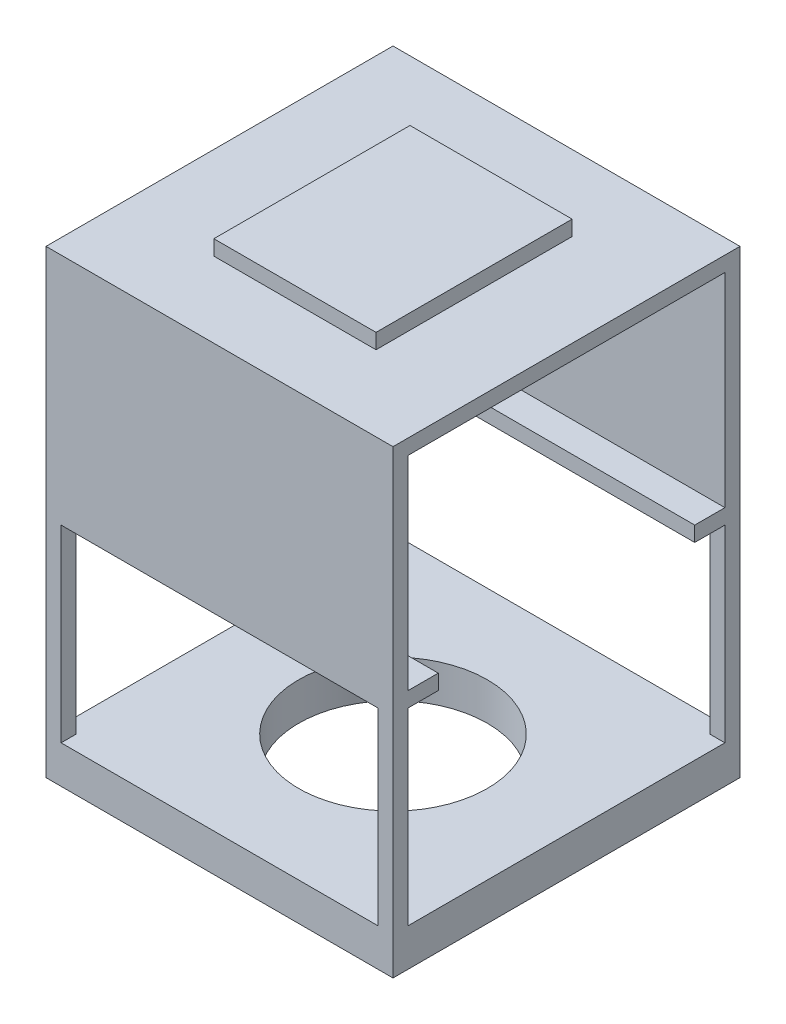
ISO-10303-21;
HEADER;
FILE_DESCRIPTION(('STEP AP214'),'2;1');
FILE_NAME('part.step','',(''),(''),'','','');
FILE_SCHEMA(('AUTOMOTIVE_DESIGN { 1 0 10303 214 1 1 1 1 }'));
ENDSEC;
DATA;
#1=APPLICATION_CONTEXT('core data for automotive mechanical design processes');
#2=APPLICATION_PROTOCOL_DEFINITION('international standard','automotive_design',2000,#1);
#3=PRODUCT_CONTEXT('',#1,'mechanical');
#4=PRODUCT('Part','Part','',(#3));
#5=PRODUCT_RELATED_PRODUCT_CATEGORY('part','',(#4));
#6=PRODUCT_DEFINITION_FORMATION('','',#4);
#7=PRODUCT_DEFINITION_CONTEXT('part definition',#1,'design');
#8=PRODUCT_DEFINITION('design','',#6,#7);
#9=PRODUCT_DEFINITION_SHAPE('','',#8);
#10=(LENGTH_UNIT() NAMED_UNIT(*) SI_UNIT(.MILLI.,.METRE.));
#11=(NAMED_UNIT(*) PLANE_ANGLE_UNIT() SI_UNIT($,.RADIAN.));
#12=(NAMED_UNIT(*) SI_UNIT($,.STERADIAN.) SOLID_ANGLE_UNIT());
#13=UNCERTAINTY_MEASURE_WITH_UNIT(LENGTH_MEASURE(1.E-05),#10,'distance_accuracy_value','');
#14=(GEOMETRIC_REPRESENTATION_CONTEXT(3) GLOBAL_UNCERTAINTY_ASSIGNED_CONTEXT((#13)) GLOBAL_UNIT_ASSIGNED_CONTEXT((#10,
#11,#12)) REPRESENTATION_CONTEXT('',''));
#15=CARTESIAN_POINT('',(0.,0.,0.));
#16=DIRECTION('',(0.,0.,1.));
#17=DIRECTION('',(1.,0.,0.));
#18=AXIS2_PLACEMENT_3D('',#15,#16,#17);
#19=CARTESIAN_POINT('',(-23.,-61.,21.));
#20=DIRECTION('',(0.,0.,1.));
#21=DIRECTION('',(1.,0.,0.));
#22=AXIS2_PLACEMENT_3D('',#19,#20,#21);
#23=PLANE('',#22);
#24=DIRECTION('',(1.,0.,0.));
#25=VECTOR('',#24,1.);
#26=CARTESIAN_POINT('',(-23.,-56.,21.));
#27=LINE('',#26,#25);
#28=CARTESIAN_POINT('',(-23.,-56.,21.));
#29=VERTEX_POINT('',#28);
#30=CARTESIAN_POINT('',(-21.,-56.,21.));
#31=VERTEX_POINT('',#30);
#32=EDGE_CURVE('E478',#29,#31,#27,.T.);
#33=ORIENTED_EDGE('',*,*,#32,.F.);
#34=DIRECTION('',(0.,1.,0.));
#35=VECTOR('',#34,1.);
#36=CARTESIAN_POINT('',(-23.,-61.,21.));
#37=LINE('',#36,#35);
#38=CARTESIAN_POINT('',(-23.,-31.,21.));
#39=VERTEX_POINT('',#38);
#40=EDGE_CURVE('E291',#29,#39,#37,.T.);
#41=ORIENTED_EDGE('',*,*,#40,.T.);
#42=DIRECTION('',(1.,0.,0.));
#43=VECTOR('',#42,1.);
#44=CARTESIAN_POINT('',(-23.,-31.,21.));
#45=LINE('',#44,#43);
#46=CARTESIAN_POINT('',(-21.,-31.,21.));
#47=VERTEX_POINT('',#46);
#48=EDGE_CURVE('E268',#39,#47,#45,.T.);
#49=ORIENTED_EDGE('',*,*,#48,.T.);
#50=DIRECTION('',(0.,1.,0.));
#51=VECTOR('',#50,1.);
#52=CARTESIAN_POINT('',(-21.,-61.,21.));
#53=LINE('',#52,#51);
#54=EDGE_CURVE('E278',#31,#47,#53,.T.);
#55=ORIENTED_EDGE('',*,*,#54,.F.);
#56=EDGE_LOOP('',(#33,#41,#49,#55));
#57=FACE_BOUND('',#56,.T.);
#58=ADVANCED_FACE('F33',(#57),#23,.F.);
#59=CARTESIAN_POINT('',(-21.,-61.,23.));
#60=DIRECTION('',(-1.,0.,0.));
#61=DIRECTION('',(0.,0.,1.));
#62=AXIS2_PLACEMENT_3D('',#59,#60,#61);
#63=PLANE('',#62);
#64=DIRECTION('',(0.,0.,1.));
#65=VECTOR('',#64,1.);
#66=CARTESIAN_POINT('',(-21.,-56.,23.));
#67=LINE('',#66,#65);
#68=CARTESIAN_POINT('',(-21.,-56.,23.));
#69=VERTEX_POINT('',#68);
#70=EDGE_CURVE('E307',#31,#69,#67,.T.);
#71=ORIENTED_EDGE('',*,*,#70,.F.);
#72=ORIENTED_EDGE('',*,*,#54,.T.);
#73=DIRECTION('',(0.,0.,1.));
#74=VECTOR('',#73,1.);
#75=CARTESIAN_POINT('',(-21.,-31.,23.));
#76=LINE('',#75,#74);
#77=CARTESIAN_POINT('',(-21.,-31.,23.));
#78=VERTEX_POINT('',#77);
#79=EDGE_CURVE('E272',#47,#78,#76,.T.);
#80=ORIENTED_EDGE('',*,*,#79,.T.);
#81=DIRECTION('',(0.,1.,0.));
#82=VECTOR('',#81,1.);
#83=CARTESIAN_POINT('',(-21.,-61.,23.));
#84=LINE('',#83,#82);
#85=EDGE_CURVE('E275',#69,#78,#84,.T.);
#86=ORIENTED_EDGE('',*,*,#85,.F.);
#87=EDGE_LOOP('',(#71,#72,#80,#86));
#88=FACE_BOUND('',#87,.T.);
#89=ADVANCED_FACE('F305',(#88),#63,.F.);
#90=CARTESIAN_POINT('',(21.,-61.,23.));
#91=DIRECTION('',(1.,0.,0.));
#92=DIRECTION('',(0.,0.,-1.));
#93=AXIS2_PLACEMENT_3D('',#90,#91,#92);
#94=PLANE('',#93);
#95=DIRECTION('',(0.,0.,-1.));
#96=VECTOR('',#95,1.);
#97=CARTESIAN_POINT('',(21.,-56.,23.));
#98=LINE('',#97,#96);
#99=CARTESIAN_POINT('',(21.,-56.,23.));
#100=VERTEX_POINT('',#99);
#101=CARTESIAN_POINT('',(21.,-56.,21.));
#102=VERTEX_POINT('',#101);
#103=EDGE_CURVE('E510',#100,#102,#98,.T.);
#104=ORIENTED_EDGE('',*,*,#103,.F.);
#105=DIRECTION('',(0.,1.,0.));
#106=VECTOR('',#105,1.);
#107=CARTESIAN_POINT('',(21.,-61.,23.));
#108=LINE('',#107,#106);
#109=CARTESIAN_POINT('',(21.,-31.,23.));
#110=VERTEX_POINT('',#109);
#111=EDGE_CURVE('E266',#100,#110,#108,.T.);
#112=ORIENTED_EDGE('',*,*,#111,.T.);
#113=DIRECTION('',(0.,0.,-1.));
#114=VECTOR('',#113,1.);
#115=CARTESIAN_POINT('',(21.,-31.,23.));
#116=LINE('',#115,#114);
#117=CARTESIAN_POINT('',(21.,-31.,21.));
#118=VERTEX_POINT('',#117);
#119=EDGE_CURVE('E248',#110,#118,#116,.T.);
#120=ORIENTED_EDGE('',*,*,#119,.T.);
#121=DIRECTION('',(0.,1.,0.));
#122=VECTOR('',#121,1.);
#123=CARTESIAN_POINT('',(21.,-61.,21.));
#124=LINE('',#123,#122);
#125=EDGE_CURVE('E264',#102,#118,#124,.T.);
#126=ORIENTED_EDGE('',*,*,#125,.F.);
#127=EDGE_LOOP('',(#104,#112,#120,#126));
#128=FACE_BOUND('',#127,.T.);
#129=ADVANCED_FACE('F542',(#128),#94,.F.);
#130=CARTESIAN_POINT('',(23.,-61.,21.));
#131=DIRECTION('',(0.,0.,1.));
#132=DIRECTION('',(1.,0.,0.));
#133=AXIS2_PLACEMENT_3D('',#130,#131,#132);
#134=PLANE('',#133);
#135=DIRECTION('',(1.,0.,0.));
#136=VECTOR('',#135,1.);
#137=CARTESIAN_POINT('',(23.,-56.,21.));
#138=LINE('',#137,#136);
#139=CARTESIAN_POINT('',(23.,-56.,21.));
#140=VERTEX_POINT('',#139);
#141=EDGE_CURVE('E240',#102,#140,#138,.T.);
#142=ORIENTED_EDGE('',*,*,#141,.F.);
#143=ORIENTED_EDGE('',*,*,#125,.T.);
#144=DIRECTION('',(1.,0.,0.));
#145=VECTOR('',#144,1.);
#146=CARTESIAN_POINT('',(23.,-31.,21.));
#147=LINE('',#146,#145);
#148=CARTESIAN_POINT('',(23.,-31.,21.));
#149=VERTEX_POINT('',#148);
#150=EDGE_CURVE('E251',#118,#149,#147,.T.);
#151=ORIENTED_EDGE('',*,*,#150,.T.);
#152=DIRECTION('',(0.,1.,0.));
#153=VECTOR('',#152,1.);
#154=CARTESIAN_POINT('',(23.,-61.,21.));
#155=LINE('',#154,#153);
#156=EDGE_CURVE('E259',#140,#149,#155,.T.);
#157=ORIENTED_EDGE('',*,*,#156,.F.);
#158=EDGE_LOOP('',(#142,#143,#151,#157));
#159=FACE_BOUND('',#158,.T.);
#160=ADVANCED_FACE('F768',(#159),#134,.F.);
#161=CARTESIAN_POINT('',(-21.,-61.,-23.));
#162=DIRECTION('',(-1.,0.,0.));
#163=DIRECTION('',(0.,0.,1.));
#164=AXIS2_PLACEMENT_3D('',#161,#162,#163);
#165=PLANE('',#164);
#166=DIRECTION('',(0.,0.,1.));
#167=VECTOR('',#166,1.);
#168=CARTESIAN_POINT('',(-21.,-56.,-23.));
#169=LINE('',#168,#167);
#170=CARTESIAN_POINT('',(-21.,-56.,-23.));
#171=VERTEX_POINT('',#170);
#172=CARTESIAN_POINT('',(-21.,-56.,-21.));
#173=VERTEX_POINT('',#172);
#174=EDGE_CURVE('E225',#171,#173,#169,.T.);
#175=ORIENTED_EDGE('',*,*,#174,.F.);
#176=DIRECTION('',(0.,1.,0.));
#177=VECTOR('',#176,1.);
#178=CARTESIAN_POINT('',(-21.,-61.,-23.));
#179=LINE('',#178,#177);
#180=CARTESIAN_POINT('',(-21.,-31.,-23.));
#181=VERTEX_POINT('',#180);
#182=EDGE_CURVE('E237',#171,#181,#179,.T.);
#183=ORIENTED_EDGE('',*,*,#182,.T.);
#184=DIRECTION('',(0.,0.,1.));
#185=VECTOR('',#184,1.);
#186=CARTESIAN_POINT('',(-21.,-31.,-23.));
#187=LINE('',#186,#185);
#188=CARTESIAN_POINT('',(-21.,-31.,-21.));
#189=VERTEX_POINT('',#188);
#190=EDGE_CURVE('E488',#181,#189,#187,.T.);
#191=ORIENTED_EDGE('',*,*,#190,.T.);
#192=DIRECTION('',(0.,1.,0.));
#193=VECTOR('',#192,1.);
#194=CARTESIAN_POINT('',(-21.,-61.,-21.));
#195=LINE('',#194,#193);
#196=EDGE_CURVE('E239',#173,#189,#195,.T.);
#197=ORIENTED_EDGE('',*,*,#196,.F.);
#198=EDGE_LOOP('',(#175,#183,#191,#197));
#199=FACE_BOUND('',#198,.T.);
#200=ADVANCED_FACE('F235',(#199),#165,.F.);
#201=CARTESIAN_POINT('',(-23.,-61.,-21.));
#202=DIRECTION('',(0.,0.,-1.));
#203=DIRECTION('',(-1.,0.,0.));
#204=AXIS2_PLACEMENT_3D('',#201,#202,#203);
#205=PLANE('',#204);
#206=DIRECTION('',(-1.,0.,0.));
#207=VECTOR('',#206,1.);
#208=CARTESIAN_POINT('',(-23.,-56.,-21.));
#209=LINE('',#208,#207);
#210=CARTESIAN_POINT('',(-23.,-56.,-21.));
#211=VERTEX_POINT('',#210);
#212=EDGE_CURVE('E241',#173,#211,#209,.T.);
#213=ORIENTED_EDGE('',*,*,#212,.F.);
#214=ORIENTED_EDGE('',*,*,#196,.T.);
#215=DIRECTION('',(-1.,0.,0.));
#216=VECTOR('',#215,1.);
#217=CARTESIAN_POINT('',(-23.,-31.,-21.));
#218=LINE('',#217,#216);
#219=CARTESIAN_POINT('',(-23.,-31.,-21.));
#220=VERTEX_POINT('',#219);
#221=EDGE_CURVE('E492',#189,#220,#218,.T.);
#222=ORIENTED_EDGE('',*,*,#221,.T.);
#223=DIRECTION('',(0.,1.,0.));
#224=VECTOR('',#223,1.);
#225=CARTESIAN_POINT('',(-23.,-61.,-21.));
#226=LINE('',#225,#224);
#227=EDGE_CURVE('E253',#211,#220,#226,.T.);
#228=ORIENTED_EDGE('',*,*,#227,.F.);
#229=EDGE_LOOP('',(#213,#214,#222,#228));
#230=FACE_BOUND('',#229,.T.);
#231=ADVANCED_FACE('F502',(#230),#205,.F.);
#232=CARTESIAN_POINT('',(23.,-61.,-21.));
#233=DIRECTION('',(0.,0.,-1.));
#234=DIRECTION('',(-1.,0.,0.));
#235=AXIS2_PLACEMENT_3D('',#232,#233,#234);
#236=PLANE('',#235);
#237=DIRECTION('',(-1.,0.,0.));
#238=VECTOR('',#237,1.);
#239=CARTESIAN_POINT('',(23.,-56.,-21.));
#240=LINE('',#239,#238);
#241=CARTESIAN_POINT('',(23.,-56.,-21.));
#242=VERTEX_POINT('',#241);
#243=CARTESIAN_POINT('',(21.,-56.,-21.));
#244=VERTEX_POINT('',#243);
#245=EDGE_CURVE('E503',#242,#244,#240,.T.);
#246=ORIENTED_EDGE('',*,*,#245,.F.);
#247=DIRECTION('',(0.,1.,0.));
#248=VECTOR('',#247,1.);
#249=CARTESIAN_POINT('',(23.,-61.,-21.));
#250=LINE('',#249,#248);
#251=CARTESIAN_POINT('',(23.,-31.,-21.));
#252=VERTEX_POINT('',#251);
#253=EDGE_CURVE('E58',#242,#252,#250,.T.);
#254=ORIENTED_EDGE('',*,*,#253,.T.);
#255=DIRECTION('',(-1.,0.,0.));
#256=VECTOR('',#255,1.);
#257=CARTESIAN_POINT('',(23.,-31.,-21.));
#258=LINE('',#257,#256);
#259=CARTESIAN_POINT('',(21.,-31.,-21.));
#260=VERTEX_POINT('',#259);
#261=EDGE_CURVE('E476',#252,#260,#258,.T.);
#262=ORIENTED_EDGE('',*,*,#261,.T.);
#263=DIRECTION('',(0.,1.,0.));
#264=VECTOR('',#263,1.);
#265=CARTESIAN_POINT('',(21.,-61.,-21.));
#266=LINE('',#265,#264);
#267=EDGE_CURVE('E50',#244,#260,#266,.T.);
#268=ORIENTED_EDGE('',*,*,#267,.F.);
#269=EDGE_LOOP('',(#246,#254,#262,#268));
#270=FACE_BOUND('',#269,.T.);
#271=ADVANCED_FACE('F749',(#270),#236,.F.);
#272=CARTESIAN_POINT('',(21.,-61.,-23.));
#273=DIRECTION('',(1.,0.,0.));
#274=DIRECTION('',(0.,0.,-1.));
#275=AXIS2_PLACEMENT_3D('',#272,#273,#274);
#276=PLANE('',#275);
#277=DIRECTION('',(0.,0.,-1.));
#278=VECTOR('',#277,1.);
#279=CARTESIAN_POINT('',(21.,-56.,-23.));
#280=LINE('',#279,#278);
#281=CARTESIAN_POINT('',(21.,-56.,-23.));
#282=VERTEX_POINT('',#281);
#283=EDGE_CURVE('E11',#244,#282,#280,.T.);
#284=ORIENTED_EDGE('',*,*,#283,.F.);
#285=ORIENTED_EDGE('',*,*,#267,.T.);
#286=DIRECTION('',(0.,0.,-1.));
#287=VECTOR('',#286,1.);
#288=CARTESIAN_POINT('',(21.,-31.,-23.));
#289=LINE('',#288,#287);
#290=CARTESIAN_POINT('',(21.,-31.,-23.));
#291=VERTEX_POINT('',#290);
#292=EDGE_CURVE('E477',#260,#291,#289,.T.);
#293=ORIENTED_EDGE('',*,*,#292,.T.);
#294=DIRECTION('',(0.,1.,0.));
#295=VECTOR('',#294,1.);
#296=CARTESIAN_POINT('',(21.,-61.,-23.));
#297=LINE('',#296,#295);
#298=EDGE_CURVE('E480',#282,#291,#297,.T.);
#299=ORIENTED_EDGE('',*,*,#298,.F.);
#300=EDGE_LOOP('',(#284,#285,#293,#299));
#301=FACE_BOUND('',#300,.T.);
#302=ADVANCED_FACE('F562',(#301),#276,.F.);
#303=CARTESIAN_POINT('',(0.,-31.,0.));
#304=DIRECTION('',(0.,-1.,0.));
#305=DIRECTION('',(0.,0.,-1.));
#306=AXIS2_PLACEMENT_3D('',#303,#304,#305);
#307=PLANE('',#306);
#308=ORIENTED_EDGE('',*,*,#292,.F.);
#309=ORIENTED_EDGE('',*,*,#261,.F.);
#310=DIRECTION('',(0.,0.,1.));
#311=VECTOR('',#310,1.);
#312=CARTESIAN_POINT('',(23.,-31.,-23.));
#313=LINE('',#312,#311);
#314=CARTESIAN_POINT('',(23.,-31.,-17.));
#315=VERTEX_POINT('',#314);
#316=EDGE_CURVE('E328',#252,#315,#313,.T.);
#317=ORIENTED_EDGE('',*,*,#316,.T.);
#318=DIRECTION('',(-1.,0.,0.));
#319=VECTOR('',#318,1.);
#320=CARTESIAN_POINT('',(-17.,-31.,-17.));
#321=LINE('',#320,#319);
#322=CARTESIAN_POINT('',(-17.,-31.,-17.));
#323=VERTEX_POINT('',#322);
#324=EDGE_CURVE('E292',#315,#323,#321,.T.);
#325=ORIENTED_EDGE('',*,*,#324,.T.);
#326=DIRECTION('',(0.,0.,1.));
#327=VECTOR('',#326,1.);
#328=CARTESIAN_POINT('',(-17.,-31.,17.));
#329=LINE('',#328,#327);
#330=CARTESIAN_POINT('',(-17.,-31.,17.));
#331=VERTEX_POINT('',#330);
#332=EDGE_CURVE('E299',#323,#331,#329,.T.);
#333=ORIENTED_EDGE('',*,*,#332,.T.);
#334=DIRECTION('',(1.,0.,0.));
#335=VECTOR('',#334,1.);
#336=CARTESIAN_POINT('',(23.,-31.,17.));
#337=LINE('',#336,#335);
#338=CARTESIAN_POINT('',(23.,-31.,17.));
#339=VERTEX_POINT('',#338);
#340=EDGE_CURVE('E413',#331,#339,#337,.T.);
#341=ORIENTED_EDGE('',*,*,#340,.T.);
#342=EDGE_CURVE('E327',#339,#149,#313,.T.);
#343=ORIENTED_EDGE('',*,*,#342,.T.);
#344=ORIENTED_EDGE('',*,*,#150,.F.);
#345=ORIENTED_EDGE('',*,*,#119,.F.);
#346=DIRECTION('',(-1.,0.,0.));
#347=VECTOR('',#346,1.);
#348=CARTESIAN_POINT('',(23.,-31.,23.));
#349=LINE('',#348,#347);
#350=EDGE_CURVE('E288',#110,#78,#349,.T.);
#351=ORIENTED_EDGE('',*,*,#350,.T.);
#352=ORIENTED_EDGE('',*,*,#79,.F.);
#353=ORIENTED_EDGE('',*,*,#48,.F.);
#354=DIRECTION('',(0.,0.,-1.));
#355=VECTOR('',#354,1.);
#356=CARTESIAN_POINT('',(-23.,-31.,23.));
#357=LINE('',#356,#355);
#358=EDGE_CURVE('E317',#39,#220,#357,.T.);
#359=ORIENTED_EDGE('',*,*,#358,.T.);
#360=ORIENTED_EDGE('',*,*,#221,.F.);
#361=ORIENTED_EDGE('',*,*,#190,.F.);
#362=DIRECTION('',(1.,0.,0.));
#363=VECTOR('',#362,1.);
#364=CARTESIAN_POINT('',(-23.,-31.,-23.));
#365=LINE('',#364,#363);
#366=EDGE_CURVE('E246',#181,#291,#365,.T.);
#367=ORIENTED_EDGE('',*,*,#366,.T.);
#368=EDGE_LOOP('',(#308,#309,#317,#325,#333,#341,#343,#344,#345,#351,#352,#353,#359,#360,#361,#367));
#369=FACE_BOUND('',#368,.T.);
#370=ADVANCED_FACE('F310',(#369),#307,.T.);
#371=CARTESIAN_POINT('',(-21.,-31.,21.));
#372=DIRECTION('',(0.,0.,-1.));
#373=DIRECTION('',(-1.,0.,0.));
#374=AXIS2_PLACEMENT_3D('',#371,#372,#373);
#375=PLANE('',#374);
#376=DIRECTION('',(0.,-1.,0.));
#377=VECTOR('',#376,1.);
#378=CARTESIAN_POINT('',(23.,-31.,21.));
#379=LINE('',#378,#377);
#380=CARTESIAN_POINT('',(23.,-2.,21.));
#381=VERTEX_POINT('',#380);
#382=CARTESIAN_POINT('',(23.,-29.,21.));
#383=VERTEX_POINT('',#382);
#384=EDGE_CURVE('E442',#381,#383,#379,.T.);
#385=ORIENTED_EDGE('',*,*,#384,.T.);
#386=DIRECTION('',(-1.,0.,0.));
#387=VECTOR('',#386,1.);
#388=CARTESIAN_POINT('',(-21.,-29.,21.));
#389=LINE('',#388,#387);
#390=CARTESIAN_POINT('',(-21.,-29.,21.));
#391=VERTEX_POINT('',#390);
#392=EDGE_CURVE('E405',#383,#391,#389,.T.);
#393=ORIENTED_EDGE('',*,*,#392,.T.);
#394=DIRECTION('',(0.,1.,0.));
#395=VECTOR('',#394,1.);
#396=CARTESIAN_POINT('',(-21.,-31.,21.));
#397=LINE('',#396,#395);
#398=CARTESIAN_POINT('',(-21.,-2.,21.));
#399=VERTEX_POINT('',#398);
#400=EDGE_CURVE('E452',#391,#399,#397,.T.);
#401=ORIENTED_EDGE('',*,*,#400,.T.);
#402=DIRECTION('',(-1.,0.,0.));
#403=VECTOR('',#402,1.);
#404=CARTESIAN_POINT('',(-21.,-2.,21.));
#405=LINE('',#404,#403);
#406=EDGE_CURVE('E444',#381,#399,#405,.T.);
#407=ORIENTED_EDGE('',*,*,#406,.F.);
#408=EDGE_LOOP('',(#385,#393,#401,#407));
#409=FACE_BOUND('',#408,.T.);
#410=ADVANCED_FACE('F455',(#409),#375,.T.);
#411=CARTESIAN_POINT('',(-21.,-31.,21.));
#412=DIRECTION('',(1.,0.,0.));
#413=DIRECTION('',(0.,0.,-1.));
#414=AXIS2_PLACEMENT_3D('',#411,#412,#413);
#415=PLANE('',#414);
#416=ORIENTED_EDGE('',*,*,#400,.F.);
#417=DIRECTION('',(0.,0.,-1.));
#418=VECTOR('',#417,1.);
#419=CARTESIAN_POINT('',(-21.,-29.,21.));
#420=LINE('',#419,#418);
#421=CARTESIAN_POINT('',(-21.,-29.,-21.));
#422=VERTEX_POINT('',#421);
#423=EDGE_CURVE('E433',#391,#422,#420,.T.);
#424=ORIENTED_EDGE('',*,*,#423,.T.);
#425=DIRECTION('',(0.,1.,0.));
#426=VECTOR('',#425,1.);
#427=CARTESIAN_POINT('',(-21.,-31.,-21.));
#428=LINE('',#427,#426);
#429=CARTESIAN_POINT('',(-21.,-2.,-21.));
#430=VERTEX_POINT('',#429);
#431=EDGE_CURVE('E391',#422,#430,#428,.T.);
#432=ORIENTED_EDGE('',*,*,#431,.T.);
#433=DIRECTION('',(0.,0.,-1.));
#434=VECTOR('',#433,1.);
#435=CARTESIAN_POINT('',(-21.,-2.,21.));
#436=LINE('',#435,#434);
#437=EDGE_CURVE('E447',#399,#430,#436,.T.);
#438=ORIENTED_EDGE('',*,*,#437,.F.);
#439=EDGE_LOOP('',(#416,#424,#432,#438));
#440=FACE_BOUND('',#439,.T.);
#441=ADVANCED_FACE('F460',(#440),#415,.T.);
#442=CARTESIAN_POINT('',(-21.,-31.,-21.));
#443=DIRECTION('',(0.,0.,1.));
#444=DIRECTION('',(1.,0.,0.));
#445=AXIS2_PLACEMENT_3D('',#442,#443,#444);
#446=PLANE('',#445);
#447=ORIENTED_EDGE('',*,*,#431,.F.);
#448=DIRECTION('',(1.,0.,0.));
#449=VECTOR('',#448,1.);
#450=CARTESIAN_POINT('',(-21.,-29.,-21.));
#451=LINE('',#450,#449);
#452=CARTESIAN_POINT('',(23.,-29.,-21.));
#453=VERTEX_POINT('',#452);
#454=EDGE_CURVE('E42',#422,#453,#451,.T.);
#455=ORIENTED_EDGE('',*,*,#454,.T.);
#456=DIRECTION('',(0.,1.,0.));
#457=VECTOR('',#456,1.);
#458=CARTESIAN_POINT('',(23.,-2.,-21.));
#459=LINE('',#458,#457);
#460=CARTESIAN_POINT('',(23.,-2.,-21.));
#461=VERTEX_POINT('',#460);
#462=EDGE_CURVE('E389',#453,#461,#459,.T.);
#463=ORIENTED_EDGE('',*,*,#462,.T.);
#464=DIRECTION('',(1.,0.,0.));
#465=VECTOR('',#464,1.);
#466=CARTESIAN_POINT('',(-21.,-2.,-21.));
#467=LINE('',#466,#465);
#468=EDGE_CURVE('E450',#430,#461,#467,.T.);
#469=ORIENTED_EDGE('',*,*,#468,.F.);
#470=EDGE_LOOP('',(#447,#455,#463,#469));
#471=FACE_BOUND('',#470,.T.);
#472=ADVANCED_FACE('F387',(#471),#446,.T.);
#473=CARTESIAN_POINT('',(10.75,2.,13.));
#474=DIRECTION('',(-1.,0.,0.));
#475=DIRECTION('',(0.,0.,1.));
#476=AXIS2_PLACEMENT_3D('',#473,#474,#475);
#477=PLANE('',#476);
#478=DIRECTION('',(0.,0.,-1.));
#479=VECTOR('',#478,1.);
#480=CARTESIAN_POINT('',(10.75,0.,13.));
#481=LINE('',#480,#479);
#482=CARTESIAN_POINT('',(10.75,0.,13.));
#483=VERTEX_POINT('',#482);
#484=CARTESIAN_POINT('',(10.75,0.,-13.));
#485=VERTEX_POINT('',#484);
#486=EDGE_CURVE('E350',#483,#485,#481,.T.);
#487=ORIENTED_EDGE('',*,*,#486,.T.);
#488=DIRECTION('',(0.,-1.,0.));
#489=VECTOR('',#488,1.);
#490=CARTESIAN_POINT('',(10.75,2.,-13.));
#491=LINE('',#490,#489);
#492=CARTESIAN_POINT('',(10.75,2.,-13.));
#493=VERTEX_POINT('',#492);
#494=EDGE_CURVE('E379',#493,#485,#491,.T.);
#495=ORIENTED_EDGE('',*,*,#494,.F.);
#496=DIRECTION('',(0.,0.,-1.));
#497=VECTOR('',#496,1.);
#498=CARTESIAN_POINT('',(10.75,2.,13.));
#499=LINE('',#498,#497);
#500=CARTESIAN_POINT('',(10.75,2.,13.));
#501=VERTEX_POINT('',#500);
#502=EDGE_CURVE('E351',#501,#493,#499,.T.);
#503=ORIENTED_EDGE('',*,*,#502,.F.);
#504=DIRECTION('',(0.,-1.,0.));
#505=VECTOR('',#504,1.);
#506=CARTESIAN_POINT('',(10.75,2.,13.));
#507=LINE('',#506,#505);
#508=EDGE_CURVE('E361',#501,#483,#507,.T.);
#509=ORIENTED_EDGE('',*,*,#508,.T.);
#510=EDGE_LOOP('',(#487,#495,#503,#509));
#511=FACE_BOUND('',#510,.T.);
#512=ADVANCED_FACE('F35',(#511),#477,.F.);
#513=CARTESIAN_POINT('',(-10.75,2.,-13.));
#514=DIRECTION('',(0.,0.,1.));
#515=DIRECTION('',(1.,0.,0.));
#516=AXIS2_PLACEMENT_3D('',#513,#514,#515);
#517=PLANE('',#516);
#518=DIRECTION('',(-1.,0.,0.));
#519=VECTOR('',#518,1.);
#520=CARTESIAN_POINT('',(-10.75,0.,-13.));
#521=LINE('',#520,#519);
#522=CARTESIAN_POINT('',(-10.75,0.,-13.));
#523=VERTEX_POINT('',#522);
#524=EDGE_CURVE('E364',#485,#523,#521,.T.);
#525=ORIENTED_EDGE('',*,*,#524,.T.);
#526=DIRECTION('',(0.,-1.,0.));
#527=VECTOR('',#526,1.);
#528=CARTESIAN_POINT('',(-10.75,2.,-13.));
#529=LINE('',#528,#527);
#530=CARTESIAN_POINT('',(-10.75,2.,-13.));
#531=VERTEX_POINT('',#530);
#532=EDGE_CURVE('E377',#531,#523,#529,.T.);
#533=ORIENTED_EDGE('',*,*,#532,.F.);
#534=DIRECTION('',(-1.,0.,0.));
#535=VECTOR('',#534,1.);
#536=CARTESIAN_POINT('',(-10.75,2.,-13.));
#537=LINE('',#536,#535);
#538=EDGE_CURVE('E354',#493,#531,#537,.T.);
#539=ORIENTED_EDGE('',*,*,#538,.F.);
#540=ORIENTED_EDGE('',*,*,#494,.T.);
#541=EDGE_LOOP('',(#525,#533,#539,#540));
#542=FACE_BOUND('',#541,.T.);
#543=ADVANCED_FACE('F587',(#542),#517,.F.);
#544=CARTESIAN_POINT('',(-10.75,2.,13.));
#545=DIRECTION('',(1.,0.,0.));
#546=DIRECTION('',(0.,0.,-1.));
#547=AXIS2_PLACEMENT_3D('',#544,#545,#546);
#548=PLANE('',#547);
#549=DIRECTION('',(0.,0.,1.));
#550=VECTOR('',#549,1.);
#551=CARTESIAN_POINT('',(-10.75,0.,13.));
#552=LINE('',#551,#550);
#553=CARTESIAN_POINT('',(-10.75,0.,13.));
#554=VERTEX_POINT('',#553);
#555=EDGE_CURVE('E367',#523,#554,#552,.T.);
#556=ORIENTED_EDGE('',*,*,#555,.T.);
#557=DIRECTION('',(0.,-1.,0.));
#558=VECTOR('',#557,1.);
#559=CARTESIAN_POINT('',(-10.75,2.,13.));
#560=LINE('',#559,#558);
#561=CARTESIAN_POINT('',(-10.75,2.,13.));
#562=VERTEX_POINT('',#561);
#563=EDGE_CURVE('E374',#562,#554,#560,.T.);
#564=ORIENTED_EDGE('',*,*,#563,.F.);
#565=DIRECTION('',(0.,0.,1.));
#566=VECTOR('',#565,1.);
#567=CARTESIAN_POINT('',(-10.75,2.,13.));
#568=LINE('',#567,#566);
#569=EDGE_CURVE('E357',#531,#562,#568,.T.);
#570=ORIENTED_EDGE('',*,*,#569,.F.);
#571=ORIENTED_EDGE('',*,*,#532,.T.);
#572=EDGE_LOOP('',(#556,#564,#570,#571));
#573=FACE_BOUND('',#572,.T.);
#574=ADVANCED_FACE('F584',(#573),#548,.F.);
#575=CARTESIAN_POINT('',(-10.75,2.,13.));
#576=DIRECTION('',(0.,0.,-1.));
#577=DIRECTION('',(-1.,0.,0.));
#578=AXIS2_PLACEMENT_3D('',#575,#576,#577);
#579=PLANE('',#578);
#580=DIRECTION('',(1.,0.,0.));
#581=VECTOR('',#580,1.);
#582=CARTESIAN_POINT('',(-10.75,0.,13.));
#583=LINE('',#582,#581);
#584=EDGE_CURVE('E355',#554,#483,#583,.T.);
#585=ORIENTED_EDGE('',*,*,#584,.T.);
#586=ORIENTED_EDGE('',*,*,#508,.F.);
#587=DIRECTION('',(1.,0.,0.));
#588=VECTOR('',#587,1.);
#589=CARTESIAN_POINT('',(-10.75,2.,13.));
#590=LINE('',#589,#588);
#591=EDGE_CURVE('E359',#562,#501,#590,.T.);
#592=ORIENTED_EDGE('',*,*,#591,.F.);
#593=ORIENTED_EDGE('',*,*,#563,.T.);
#594=EDGE_LOOP('',(#585,#586,#592,#593));
#595=FACE_BOUND('',#594,.T.);
#596=ADVANCED_FACE('F580',(#595),#579,.F.);
#597=CARTESIAN_POINT('',(0.,2.,0.));
#598=DIRECTION('',(0.,-1.,0.));
#599=DIRECTION('',(0.,0.,-1.));
#600=AXIS2_PLACEMENT_3D('',#597,#598,#599);
#601=PLANE('',#600);
#602=ORIENTED_EDGE('',*,*,#502,.T.);
#603=ORIENTED_EDGE('',*,*,#538,.T.);
#604=ORIENTED_EDGE('',*,*,#569,.T.);
#605=ORIENTED_EDGE('',*,*,#591,.T.);
#606=EDGE_LOOP('',(#602,#603,#604,#605));
#607=FACE_BOUND('',#606,.T.);
#608=ADVANCED_FACE('F568',(#607),#601,.F.);
#609=CARTESIAN_POINT('',(0.,0.,0.));
#610=DIRECTION('',(0.,1.,0.));
#611=DIRECTION('',(0.,0.,1.));
#612=AXIS2_PLACEMENT_3D('',#609,#610,#611);
#613=PLANE('',#612);
#614=DIRECTION('',(0.,0.,1.));
#615=VECTOR('',#614,1.);
#616=CARTESIAN_POINT('',(23.,0.,-23.));
#617=LINE('',#616,#615);
#618=CARTESIAN_POINT('',(23.,0.,-23.));
#619=VERTEX_POINT('',#618);
#620=CARTESIAN_POINT('',(23.,0.,23.));
#621=VERTEX_POINT('',#620);
#622=EDGE_CURVE('E330',#619,#621,#617,.T.);
#623=ORIENTED_EDGE('',*,*,#622,.F.);
#624=DIRECTION('',(1.,0.,0.));
#625=VECTOR('',#624,1.);
#626=CARTESIAN_POINT('',(-23.,0.,-23.));
#627=LINE('',#626,#625);
#628=CARTESIAN_POINT('',(-23.,0.,-23.));
#629=VERTEX_POINT('',#628);
#630=EDGE_CURVE('E339',#629,#619,#627,.T.);
#631=ORIENTED_EDGE('',*,*,#630,.F.);
#632=DIRECTION('',(0.,0.,-1.));
#633=VECTOR('',#632,1.);
#634=CARTESIAN_POINT('',(-23.,0.,-23.));
#635=LINE('',#634,#633);
#636=CARTESIAN_POINT('',(-23.,0.,23.));
#637=VERTEX_POINT('',#636);
#638=EDGE_CURVE('E336',#637,#629,#635,.T.);
#639=ORIENTED_EDGE('',*,*,#638,.F.);
#640=DIRECTION('',(-1.,0.,0.));
#641=VECTOR('',#640,1.);
#642=CARTESIAN_POINT('',(-23.,0.,23.));
#643=LINE('',#642,#641);
#644=EDGE_CURVE('E333',#621,#637,#643,.T.);
#645=ORIENTED_EDGE('',*,*,#644,.F.);
#646=EDGE_LOOP('',(#623,#631,#639,#645));
#647=FACE_BOUND('',#646,.T.);
#648=ORIENTED_EDGE('',*,*,#486,.F.);
#649=ORIENTED_EDGE('',*,*,#584,.F.);
#650=ORIENTED_EDGE('',*,*,#555,.F.);
#651=ORIENTED_EDGE('',*,*,#524,.F.);
#652=EDGE_LOOP('',(#648,#649,#650,#651));
#653=FACE_BOUND('',#652,.T.);
#654=ADVANCED_FACE('F565',(#647,#653),#613,.T.);
#655=CARTESIAN_POINT('',(23.,-2.,-23.));
#656=DIRECTION('',(-1.,0.,0.));
#657=DIRECTION('',(0.,0.,1.));
#658=AXIS2_PLACEMENT_3D('',#655,#656,#657);
#659=PLANE('',#658);
#660=ORIENTED_EDGE('',*,*,#253,.F.);
#661=DIRECTION('',(0.,0.,1.));
#662=VECTOR('',#661,1.);
#663=CARTESIAN_POINT('',(23.,-56.,23.));
#664=LINE('',#663,#662);
#665=EDGE_CURVE('E230',#242,#140,#664,.T.);
#666=ORIENTED_EDGE('',*,*,#665,.T.);
#667=ORIENTED_EDGE('',*,*,#156,.T.);
#668=ORIENTED_EDGE('',*,*,#342,.F.);
#669=DIRECTION('',(0.,-1.,0.));
#670=VECTOR('',#669,1.);
#671=CARTESIAN_POINT('',(23.,-29.,17.));
#672=LINE('',#671,#670);
#673=CARTESIAN_POINT('',(23.,-29.,17.));
#674=VERTEX_POINT('',#673);
#675=EDGE_CURVE('E430',#674,#339,#672,.T.);
#676=ORIENTED_EDGE('',*,*,#675,.F.);
#677=DIRECTION('',(0.,0.,1.));
#678=VECTOR('',#677,1.);
#679=CARTESIAN_POINT('',(23.,-29.,17.));
#680=LINE('',#679,#678);
#681=EDGE_CURVE('E424',#674,#383,#680,.T.);
#682=ORIENTED_EDGE('',*,*,#681,.T.);
#683=ORIENTED_EDGE('',*,*,#384,.F.);
#684=DIRECTION('',(0.,0.,1.));
#685=VECTOR('',#684,1.);
#686=CARTESIAN_POINT('',(23.,-2.,21.));
#687=LINE('',#686,#685);
#688=EDGE_CURVE('E404',#461,#381,#687,.T.);
#689=ORIENTED_EDGE('',*,*,#688,.F.);
#690=ORIENTED_EDGE('',*,*,#462,.F.);
#691=DIRECTION('',(0.,0.,1.));
#692=VECTOR('',#691,1.);
#693=CARTESIAN_POINT('',(23.,-29.,-17.));
#694=LINE('',#693,#692);
#695=CARTESIAN_POINT('',(23.,-29.,-17.));
#696=VERTEX_POINT('',#695);
#697=EDGE_CURVE('E400',#453,#696,#694,.T.);
#698=ORIENTED_EDGE('',*,*,#697,.T.);
#699=DIRECTION('',(0.,-1.,0.));
#700=VECTOR('',#699,1.);
#701=CARTESIAN_POINT('',(23.,-29.,-17.));
#702=LINE('',#701,#700);
#703=EDGE_CURVE('E426',#696,#315,#702,.T.);
#704=ORIENTED_EDGE('',*,*,#703,.T.);
#705=ORIENTED_EDGE('',*,*,#316,.F.);
#706=EDGE_LOOP('',(#660,#666,#667,#668,#676,#682,#683,#689,#690,#698,#704,#705));
#707=FACE_BOUND('',#706,.T.);
#708=DIRECTION('',(0.,0.,1.));
#709=VECTOR('',#708,1.);
#710=CARTESIAN_POINT('',(23.,-61.,23.));
#711=LINE('',#710,#709);
#712=CARTESIAN_POINT('',(23.,-61.,-23.));
#713=VERTEX_POINT('',#712);
#714=CARTESIAN_POINT('',(23.,-61.,23.));
#715=VERTEX_POINT('',#714);
#716=EDGE_CURVE('E257',#713,#715,#711,.T.);
#717=ORIENTED_EDGE('',*,*,#716,.F.);
#718=DIRECTION('',(0.,1.,0.));
#719=VECTOR('',#718,1.);
#720=CARTESIAN_POINT('',(23.,-2.,-23.));
#721=LINE('',#720,#719);
#722=EDGE_CURVE('E342',#713,#619,#721,.T.);
#723=ORIENTED_EDGE('',*,*,#722,.T.);
#724=ORIENTED_EDGE('',*,*,#622,.T.);
#725=DIRECTION('',(0.,1.,0.));
#726=VECTOR('',#725,1.);
#727=CARTESIAN_POINT('',(23.,-2.,23.));
#728=LINE('',#727,#726);
#729=EDGE_CURVE('E348',#715,#621,#728,.T.);
#730=ORIENTED_EDGE('',*,*,#729,.F.);
#731=EDGE_LOOP('',(#717,#723,#724,#730));
#732=FACE_BOUND('',#731,.T.);
#733=ADVANCED_FACE('F397',(#707,#732),#659,.F.);
#734=CARTESIAN_POINT('',(-23.,-2.,23.));
#735=DIRECTION('',(0.,0.,-1.));
#736=DIRECTION('',(-1.,0.,0.));
#737=AXIS2_PLACEMENT_3D('',#734,#735,#736);
#738=PLANE('',#737);
#739=ORIENTED_EDGE('',*,*,#111,.F.);
#740=DIRECTION('',(-1.,0.,0.));
#741=VECTOR('',#740,1.);
#742=CARTESIAN_POINT('',(-23.,-56.,23.));
#743=LINE('',#742,#741);
#744=EDGE_CURVE('E505',#100,#69,#743,.T.);
#745=ORIENTED_EDGE('',*,*,#744,.T.);
#746=ORIENTED_EDGE('',*,*,#85,.T.);
#747=ORIENTED_EDGE('',*,*,#350,.F.);
#748=EDGE_LOOP('',(#739,#745,#746,#747));
#749=FACE_BOUND('',#748,.T.);
#750=DIRECTION('',(-1.,0.,0.));
#751=VECTOR('',#750,1.);
#752=CARTESIAN_POINT('',(-23.,-61.,23.));
#753=LINE('',#752,#751);
#754=CARTESIAN_POINT('',(-23.,-61.,23.));
#755=VERTEX_POINT('',#754);
#756=EDGE_CURVE('E271',#715,#755,#753,.T.);
#757=ORIENTED_EDGE('',*,*,#756,.F.);
#758=ORIENTED_EDGE('',*,*,#729,.T.);
#759=ORIENTED_EDGE('',*,*,#644,.T.);
#760=DIRECTION('',(0.,1.,0.));
#761=VECTOR('',#760,1.);
#762=CARTESIAN_POINT('',(-23.,-2.,23.));
#763=LINE('',#762,#761);
#764=EDGE_CURVE('E346',#755,#637,#763,.T.);
#765=ORIENTED_EDGE('',*,*,#764,.F.);
#766=EDGE_LOOP('',(#757,#758,#759,#765));
#767=FACE_BOUND('',#766,.T.);
#768=ADVANCED_FACE('F515',(#749,#767),#738,.F.);
#769=CARTESIAN_POINT('',(-23.,-2.,-23.));
#770=DIRECTION('',(1.,0.,0.));
#771=DIRECTION('',(0.,0.,-1.));
#772=AXIS2_PLACEMENT_3D('',#769,#770,#771);
#773=PLANE('',#772);
#774=ORIENTED_EDGE('',*,*,#40,.F.);
#775=DIRECTION('',(0.,0.,-1.));
#776=VECTOR('',#775,1.);
#777=CARTESIAN_POINT('',(-23.,-56.,23.));
#778=LINE('',#777,#776);
#779=EDGE_CURVE('E231',#29,#211,#778,.T.);
#780=ORIENTED_EDGE('',*,*,#779,.T.);
#781=ORIENTED_EDGE('',*,*,#227,.T.);
#782=ORIENTED_EDGE('',*,*,#358,.F.);
#783=EDGE_LOOP('',(#774,#780,#781,#782));
#784=FACE_BOUND('',#783,.T.);
#785=DIRECTION('',(0.,1.,0.));
#786=VECTOR('',#785,1.);
#787=CARTESIAN_POINT('',(-23.,-2.,-23.));
#788=LINE('',#787,#786);
#789=CARTESIAN_POINT('',(-23.,-61.,-23.));
#790=VERTEX_POINT('',#789);
#791=EDGE_CURVE('E344',#790,#629,#788,.T.);
#792=ORIENTED_EDGE('',*,*,#791,.F.);
#793=DIRECTION('',(0.,0.,-1.));
#794=VECTOR('',#793,1.);
#795=CARTESIAN_POINT('',(-23.,-61.,23.));
#796=LINE('',#795,#794);
#797=EDGE_CURVE('E269',#755,#790,#796,.T.);
#798=ORIENTED_EDGE('',*,*,#797,.F.);
#799=ORIENTED_EDGE('',*,*,#764,.T.);
#800=ORIENTED_EDGE('',*,*,#638,.T.);
#801=EDGE_LOOP('',(#792,#798,#799,#800));
#802=FACE_BOUND('',#801,.T.);
#803=ADVANCED_FACE('F498',(#784,#802),#773,.F.);
#804=CARTESIAN_POINT('',(-23.,-2.,-23.));
#805=DIRECTION('',(0.,0.,1.));
#806=DIRECTION('',(1.,0.,0.));
#807=AXIS2_PLACEMENT_3D('',#804,#805,#806);
#808=PLANE('',#807);
#809=ORIENTED_EDGE('',*,*,#182,.F.);
#810=DIRECTION('',(1.,0.,0.));
#811=VECTOR('',#810,1.);
#812=CARTESIAN_POINT('',(-23.,-56.,-23.));
#813=LINE('',#812,#811);
#814=EDGE_CURVE('E222',#171,#282,#813,.T.);
#815=ORIENTED_EDGE('',*,*,#814,.T.);
#816=ORIENTED_EDGE('',*,*,#298,.T.);
#817=ORIENTED_EDGE('',*,*,#366,.F.);
#818=EDGE_LOOP('',(#809,#815,#816,#817));
#819=FACE_BOUND('',#818,.T.);
#820=ORIENTED_EDGE('',*,*,#722,.F.);
#821=DIRECTION('',(1.,0.,0.));
#822=VECTOR('',#821,1.);
#823=CARTESIAN_POINT('',(-23.,-61.,-23.));
#824=LINE('',#823,#822);
#825=EDGE_CURVE('E489',#790,#713,#824,.T.);
#826=ORIENTED_EDGE('',*,*,#825,.F.);
#827=ORIENTED_EDGE('',*,*,#791,.T.);
#828=ORIENTED_EDGE('',*,*,#630,.T.);
#829=EDGE_LOOP('',(#820,#826,#827,#828));
#830=FACE_BOUND('',#829,.T.);
#831=ADVANCED_FACE('F243',(#819,#830),#808,.F.);
#832=CARTESIAN_POINT('',(0.,-2.,0.));
#833=DIRECTION('',(0.,1.,0.));
#834=DIRECTION('',(0.,0.,1.));
#835=AXIS2_PLACEMENT_3D('',#832,#833,#834);
#836=PLANE('',#835);
#837=ORIENTED_EDGE('',*,*,#468,.T.);
#838=ORIENTED_EDGE('',*,*,#688,.T.);
#839=ORIENTED_EDGE('',*,*,#406,.T.);
#840=ORIENTED_EDGE('',*,*,#437,.T.);
#841=EDGE_LOOP('',(#837,#838,#839,#840));
#842=FACE_BOUND('',#841,.T.);
#843=ADVANCED_FACE('F459',(#842),#836,.F.);
#844=CARTESIAN_POINT('',(23.,-29.,17.));
#845=DIRECTION('',(0.,0.,-1.));
#846=DIRECTION('',(-1.,0.,0.));
#847=AXIS2_PLACEMENT_3D('',#844,#845,#846);
#848=PLANE('',#847);
#849=ORIENTED_EDGE('',*,*,#340,.F.);
#850=DIRECTION('',(0.,-1.,0.));
#851=VECTOR('',#850,1.);
#852=CARTESIAN_POINT('',(-17.,-29.,17.));
#853=LINE('',#852,#851);
#854=CARTESIAN_POINT('',(-17.,-29.,17.));
#855=VERTEX_POINT('',#854);
#856=EDGE_CURVE('E434',#855,#331,#853,.T.);
#857=ORIENTED_EDGE('',*,*,#856,.F.);
#858=DIRECTION('',(1.,0.,0.));
#859=VECTOR('',#858,1.);
#860=CARTESIAN_POINT('',(23.,-29.,17.));
#861=LINE('',#860,#859);
#862=EDGE_CURVE('E421',#855,#674,#861,.T.);
#863=ORIENTED_EDGE('',*,*,#862,.T.);
#864=ORIENTED_EDGE('',*,*,#675,.T.);
#865=EDGE_LOOP('',(#849,#857,#863,#864));
#866=FACE_BOUND('',#865,.T.);
#867=ADVANCED_FACE('F466',(#866),#848,.T.);
#868=CARTESIAN_POINT('',(-17.,-29.,17.));
#869=DIRECTION('',(1.,0.,0.));
#870=DIRECTION('',(0.,0.,-1.));
#871=AXIS2_PLACEMENT_3D('',#868,#869,#870);
#872=PLANE('',#871);
#873=ORIENTED_EDGE('',*,*,#332,.F.);
#874=DIRECTION('',(0.,-1.,0.));
#875=VECTOR('',#874,1.);
#876=CARTESIAN_POINT('',(-17.,-29.,-17.));
#877=LINE('',#876,#875);
#878=CARTESIAN_POINT('',(-17.,-29.,-17.));
#879=VERTEX_POINT('',#878);
#880=EDGE_CURVE('E436',#879,#323,#877,.T.);
#881=ORIENTED_EDGE('',*,*,#880,.F.);
#882=DIRECTION('',(0.,0.,1.));
#883=VECTOR('',#882,1.);
#884=CARTESIAN_POINT('',(-17.,-29.,17.));
#885=LINE('',#884,#883);
#886=EDGE_CURVE('E414',#879,#855,#885,.T.);
#887=ORIENTED_EDGE('',*,*,#886,.T.);
#888=ORIENTED_EDGE('',*,*,#856,.T.);
#889=EDGE_LOOP('',(#873,#881,#887,#888));
#890=FACE_BOUND('',#889,.T.);
#891=ADVANCED_FACE('F471',(#890),#872,.T.);
#892=CARTESIAN_POINT('',(-17.,-29.,-17.));
#893=DIRECTION('',(0.,0.,1.));
#894=DIRECTION('',(1.,0.,0.));
#895=AXIS2_PLACEMENT_3D('',#892,#893,#894);
#896=PLANE('',#895);
#897=ORIENTED_EDGE('',*,*,#324,.F.);
#898=ORIENTED_EDGE('',*,*,#703,.F.);
#899=DIRECTION('',(-1.,0.,0.));
#900=VECTOR('',#899,1.);
#901=CARTESIAN_POINT('',(-17.,-29.,-17.));
#902=LINE('',#901,#900);
#903=EDGE_CURVE('E412',#696,#879,#902,.T.);
#904=ORIENTED_EDGE('',*,*,#903,.T.);
#905=ORIENTED_EDGE('',*,*,#880,.T.);
#906=EDGE_LOOP('',(#897,#898,#904,#905));
#907=FACE_BOUND('',#906,.T.);
#908=ADVANCED_FACE('F473',(#907),#896,.T.);
#909=CARTESIAN_POINT('',(0.,-29.,0.));
#910=DIRECTION('',(0.,-1.,0.));
#911=DIRECTION('',(0.,0.,-1.));
#912=AXIS2_PLACEMENT_3D('',#909,#910,#911);
#913=PLANE('',#912);
#914=ORIENTED_EDGE('',*,*,#392,.F.);
#915=ORIENTED_EDGE('',*,*,#681,.F.);
#916=ORIENTED_EDGE('',*,*,#862,.F.);
#917=ORIENTED_EDGE('',*,*,#886,.F.);
#918=ORIENTED_EDGE('',*,*,#903,.F.);
#919=ORIENTED_EDGE('',*,*,#697,.F.);
#920=ORIENTED_EDGE('',*,*,#454,.F.);
#921=ORIENTED_EDGE('',*,*,#423,.F.);
#922=EDGE_LOOP('',(#914,#915,#916,#917,#918,#919,#920,#921));
#923=FACE_BOUND('',#922,.T.);
#924=ADVANCED_FACE('F409',(#923),#913,.F.);
#925=CARTESIAN_POINT('',(0.,-61.,0.));
#926=DIRECTION('',(0.,-1.,0.));
#927=DIRECTION('',(0.,0.,-1.));
#928=AXIS2_PLACEMENT_3D('',#925,#926,#927);
#929=PLANE('',#928);
#930=CARTESIAN_POINT('',(0.,-61.,0.));
#931=DIRECTION('',(0.,-1.,0.));
#932=DIRECTION('',(0.,0.,-1.));
#933=AXIS2_PLACEMENT_3D('',#930,#931,#932);
#934=CIRCLE('',#933,12.5);
#935=CARTESIAN_POINT('',(0.,-61.,-12.5));
#936=VERTEX_POINT('',#935);
#937=EDGE_CURVE('E520',#936,#936,#934,.T.);
#938=ORIENTED_EDGE('',*,*,#937,.F.);
#939=EDGE_LOOP('',(#938));
#940=FACE_BOUND('',#939,.T.);
#941=ORIENTED_EDGE('',*,*,#797,.T.);
#942=ORIENTED_EDGE('',*,*,#825,.T.);
#943=ORIENTED_EDGE('',*,*,#716,.T.);
#944=ORIENTED_EDGE('',*,*,#756,.T.);
#945=EDGE_LOOP('',(#941,#942,#943,#944));
#946=FACE_BOUND('',#945,.T.);
#947=ADVANCED_FACE('F534',(#940,#946),#929,.T.);
#948=CARTESIAN_POINT('',(0.,-56.,0.));
#949=DIRECTION('',(0.,-1.,0.));
#950=DIRECTION('',(0.,0.,-1.));
#951=AXIS2_PLACEMENT_3D('',#948,#949,#950);
#952=PLANE('',#951);
#953=CARTESIAN_POINT('',(0.,-56.,0.));
#954=DIRECTION('',(0.,-1.,0.));
#955=DIRECTION('',(0.,0.,-1.));
#956=AXIS2_PLACEMENT_3D('',#953,#954,#955);
#957=CIRCLE('',#956,12.5);
#958=CARTESIAN_POINT('',(0.,-56.,-12.5));
#959=VERTEX_POINT('',#958);
#960=EDGE_CURVE('E37',#959,#959,#957,.T.);
#961=ORIENTED_EDGE('',*,*,#960,.T.);
#962=EDGE_LOOP('',(#961));
#963=FACE_BOUND('',#962,.T.);
#964=ORIENTED_EDGE('',*,*,#779,.F.);
#965=ORIENTED_EDGE('',*,*,#32,.T.);
#966=ORIENTED_EDGE('',*,*,#70,.T.);
#967=ORIENTED_EDGE('',*,*,#744,.F.);
#968=ORIENTED_EDGE('',*,*,#103,.T.);
#969=ORIENTED_EDGE('',*,*,#141,.T.);
#970=ORIENTED_EDGE('',*,*,#665,.F.);
#971=ORIENTED_EDGE('',*,*,#245,.T.);
#972=ORIENTED_EDGE('',*,*,#283,.T.);
#973=ORIENTED_EDGE('',*,*,#814,.F.);
#974=ORIENTED_EDGE('',*,*,#174,.T.);
#975=ORIENTED_EDGE('',*,*,#212,.T.);
#976=EDGE_LOOP('',(#964,#965,#966,#967,#968,#969,#970,#971,#972,#973,#974,#975));
#977=FACE_BOUND('',#976,.T.);
#978=ADVANCED_FACE('F224',(#963,#977),#952,.F.);
#979=CARTESIAN_POINT('',(0.,-31.,0.));
#980=DIRECTION('',(0.,-1.,0.));
#981=DIRECTION('',(0.,0.,-1.));
#982=AXIS2_PLACEMENT_3D('',#979,#980,#981);
#983=CYLINDRICAL_SURFACE('',#982,12.5);
#984=ORIENTED_EDGE('',*,*,#937,.T.);
#985=EDGE_LOOP('',(#984));
#986=FACE_BOUND('',#985,.T.);
#987=ORIENTED_EDGE('',*,*,#960,.F.);
#988=EDGE_LOOP('',(#987));
#989=FACE_BOUND('',#988,.T.);
#990=ADVANCED_FACE('F528',(#986,#989),#983,.F.);
#991=CLOSED_SHELL('',(#58,#89,#129,#160,#200,#231,#271,#302,#370,#410,#441,#472,#512,#543,#574,
#596,#608,#654,#733,#768,#803,#831,#843,#867,#891,#908,#924,#947,#978,#990));
#992=MANIFOLD_SOLID_BREP('B2',#991);
#993=ADVANCED_BREP_SHAPE_REPRESENTATION('',(#18,#992),#14);
#994=SHAPE_DEFINITION_REPRESENTATION(#9,#993);
ENDSEC;
END-ISO-10303-21;
